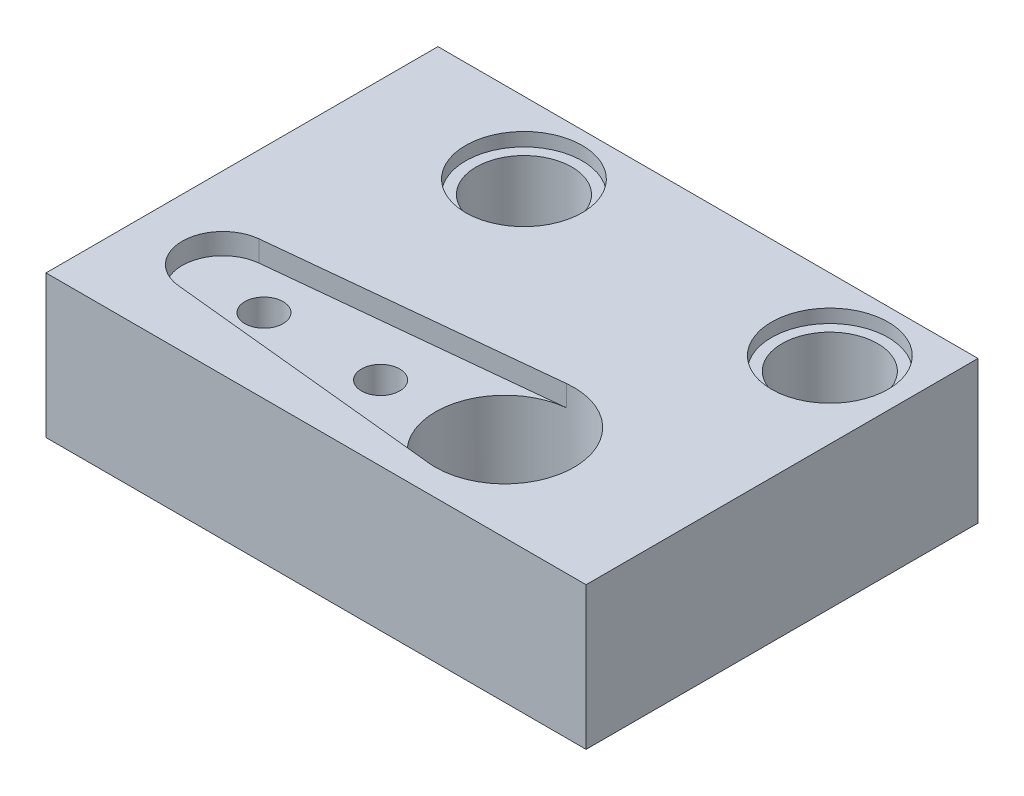
ISO-10303-21;
HEADER;
FILE_DESCRIPTION(('STEP AP214'),'2;1');
FILE_NAME('part.step','',(''),(''),'','','');
FILE_SCHEMA(('AUTOMOTIVE_DESIGN { 1 0 10303 214 1 1 1 1 }'));
ENDSEC;
DATA;
#1=APPLICATION_CONTEXT('core data for automotive mechanical design processes');
#2=APPLICATION_PROTOCOL_DEFINITION('international standard','automotive_design',2000,#1);
#3=PRODUCT_CONTEXT('',#1,'mechanical');
#4=PRODUCT('Part','Part','',(#3));
#5=PRODUCT_RELATED_PRODUCT_CATEGORY('part','',(#4));
#6=PRODUCT_DEFINITION_FORMATION('','',#4);
#7=PRODUCT_DEFINITION_CONTEXT('part definition',#1,'design');
#8=PRODUCT_DEFINITION('design','',#6,#7);
#9=PRODUCT_DEFINITION_SHAPE('','',#8);
#10=(LENGTH_UNIT() NAMED_UNIT(*) SI_UNIT(.MILLI.,.METRE.));
#11=(NAMED_UNIT(*) PLANE_ANGLE_UNIT() SI_UNIT($,.RADIAN.));
#12=(NAMED_UNIT(*) SI_UNIT($,.STERADIAN.) SOLID_ANGLE_UNIT());
#13=UNCERTAINTY_MEASURE_WITH_UNIT(LENGTH_MEASURE(1.E-05),#10,'distance_accuracy_value','');
#14=(GEOMETRIC_REPRESENTATION_CONTEXT(3) GLOBAL_UNCERTAINTY_ASSIGNED_CONTEXT((#13)) GLOBAL_UNIT_ASSIGNED_CONTEXT((#10,
#11,#12)) REPRESENTATION_CONTEXT('',''));
#15=CARTESIAN_POINT('',(0.,0.,0.));
#16=DIRECTION('',(0.,0.,1.));
#17=DIRECTION('',(1.,0.,0.));
#18=AXIS2_PLACEMENT_3D('',#15,#16,#17);
#19=CARTESIAN_POINT('',(-10.75,7.46,-11.75));
#20=DIRECTION('',(0.,-1.,0.));
#21=DIRECTION('',(0.,0.,-1.));
#22=AXIS2_PLACEMENT_3D('',#19,#20,#21);
#23=CYLINDRICAL_SURFACE('',#22,2.5);
#24=CARTESIAN_POINT('',(-10.75,6.76,-11.75));
#25=DIRECTION('',(0.,1.,0.));
#26=DIRECTION('',(0.,0.,1.));
#27=AXIS2_PLACEMENT_3D('',#24,#25,#26);
#28=CIRCLE('',#27,2.5);
#29=CARTESIAN_POINT('',(-10.75,6.76,-14.25));
#30=VERTEX_POINT('',#29);
#31=EDGE_CURVE('E121',#30,#30,#28,.T.);
#32=CARTESIAN_POINT('',(-10.75,0.7,-11.75));
#33=DIRECTION('',(0.,-1.,0.));
#34=DIRECTION('',(0.,0.,-1.));
#35=AXIS2_PLACEMENT_3D('',#32,#33,#34);
#36=CIRCLE('',#35,2.5);
#37=CARTESIAN_POINT('',(-10.75,0.7,-14.25));
#38=VERTEX_POINT('',#37);
#39=EDGE_CURVE('E37',#38,#38,#36,.T.);
#40=CARTESIAN_POINT('',(-10.75,6.76,-14.25));
#41=CARTESIAN_POINT('',(-10.75,6.696875,-14.25));
#42=CARTESIAN_POINT('',(-10.75,6.63375,-14.25));
#43=CARTESIAN_POINT('',(-10.75,6.5075,-14.25));
#44=CARTESIAN_POINT('',(-10.75,6.444375,-14.25));
#45=CARTESIAN_POINT('',(-10.75,6.318125,-14.25));
#46=CARTESIAN_POINT('',(-10.75,6.255,-14.25));
#47=CARTESIAN_POINT('',(-10.75,6.12875,-14.25));
#48=CARTESIAN_POINT('',(-10.75,6.065625,-14.25));
#49=CARTESIAN_POINT('',(-10.75,5.939375,-14.25));
#50=CARTESIAN_POINT('',(-10.75,5.87625,-14.25));
#51=CARTESIAN_POINT('',(-10.75,5.75,-14.25));
#52=CARTESIAN_POINT('',(-10.75,5.686875,-14.25));
#53=CARTESIAN_POINT('',(-10.75,5.560625,-14.25));
#54=CARTESIAN_POINT('',(-10.75,5.4975,-14.25));
#55=CARTESIAN_POINT('',(-10.75,5.37125,-14.25));
#56=CARTESIAN_POINT('',(-10.75,5.308125,-14.25));
#57=CARTESIAN_POINT('',(-10.75,5.181875,-14.25));
#58=CARTESIAN_POINT('',(-10.75,5.11875,-14.25));
#59=CARTESIAN_POINT('',(-10.75,4.9925,-14.25));
#60=CARTESIAN_POINT('',(-10.75,4.929375,-14.25));
#61=CARTESIAN_POINT('',(-10.75,4.803125,-14.25));
#62=CARTESIAN_POINT('',(-10.75,4.74,-14.25));
#63=CARTESIAN_POINT('',(-10.75,4.61375,-14.25));
#64=CARTESIAN_POINT('',(-10.75,4.550625,-14.25));
#65=CARTESIAN_POINT('',(-10.75,4.424375,-14.25));
#66=CARTESIAN_POINT('',(-10.75,4.36125,-14.25));
#67=CARTESIAN_POINT('',(-10.75,4.235,-14.25));
#68=CARTESIAN_POINT('',(-10.75,4.171875,-14.25));
#69=CARTESIAN_POINT('',(-10.75,4.045625,-14.25));
#70=CARTESIAN_POINT('',(-10.75,3.9825,-14.25));
#71=CARTESIAN_POINT('',(-10.75,3.85625,-14.25));
#72=CARTESIAN_POINT('',(-10.75,3.793125,-14.25));
#73=CARTESIAN_POINT('',(-10.75,3.666875,-14.25));
#74=CARTESIAN_POINT('',(-10.75,3.60375,-14.25));
#75=CARTESIAN_POINT('',(-10.75,3.4775,-14.25));
#76=CARTESIAN_POINT('',(-10.75,3.414375,-14.25));
#77=CARTESIAN_POINT('',(-10.75,3.288125,-14.25));
#78=CARTESIAN_POINT('',(-10.75,3.225,-14.25));
#79=CARTESIAN_POINT('',(-10.75,3.09875,-14.25));
#80=CARTESIAN_POINT('',(-10.75,3.035625,-14.25));
#81=CARTESIAN_POINT('',(-10.75,2.909375,-14.25));
#82=CARTESIAN_POINT('',(-10.75,2.84625,-14.25));
#83=CARTESIAN_POINT('',(-10.75,2.72,-14.25));
#84=CARTESIAN_POINT('',(-10.75,2.656875,-14.25));
#85=CARTESIAN_POINT('',(-10.75,2.530625,-14.25));
#86=CARTESIAN_POINT('',(-10.75,2.4675,-14.25));
#87=CARTESIAN_POINT('',(-10.75,2.34125,-14.25));
#88=CARTESIAN_POINT('',(-10.75,2.278125,-14.25));
#89=CARTESIAN_POINT('',(-10.75,2.151875,-14.25));
#90=CARTESIAN_POINT('',(-10.75,2.08875,-14.25));
#91=CARTESIAN_POINT('',(-10.75,1.9625,-14.25));
#92=CARTESIAN_POINT('',(-10.75,1.899375,-14.25));
#93=CARTESIAN_POINT('',(-10.75,1.773125,-14.25));
#94=CARTESIAN_POINT('',(-10.75,1.71,-14.25));
#95=CARTESIAN_POINT('',(-10.75,1.58375,-14.25));
#96=CARTESIAN_POINT('',(-10.75,1.520625,-14.25));
#97=CARTESIAN_POINT('',(-10.75,1.394375,-14.25));
#98=CARTESIAN_POINT('',(-10.75,1.33125,-14.25));
#99=CARTESIAN_POINT('',(-10.75,1.205,-14.25));
#100=CARTESIAN_POINT('',(-10.75,1.141875,-14.25));
#101=CARTESIAN_POINT('',(-10.75,1.015625,-14.25));
#102=CARTESIAN_POINT('',(-10.75,0.952500000000001,-14.25));
#103=CARTESIAN_POINT('',(-10.75,0.82625,-14.25));
#104=CARTESIAN_POINT('',(-10.75,0.763125,-14.25));
#105=CARTESIAN_POINT('',(-10.75,0.7,-14.25));
#106=B_SPLINE_CURVE_WITH_KNOTS('',3,(#40,#41,#42,#43,#44,#45,#46,#47,#48,#49,#50,#51,#52,#53,
#54,#55,#56,#57,#58,#59,#60,#61,#62,#63,#64,#65,#66,#67,#68,#69,#70,#71,#72,#73,#74,#75,#76,#77,
#78,#79,#80,#81,#82,#83,#84,#85,#86,#87,#88,#89,#90,#91,#92,#93,#94,#95,#96,#97,#98,#99,#100,
#101,#102,#103,#104,#105),.UNSPECIFIED.,.F.,.F.,(4,2,2,2,2,2,2,2,2,2,2,2,2,2,2,2,2,2,2,2,2,2,2,
2,2,2,2,2,2,2,2,2,4),(0.,0.189375,0.37875,0.568125,0.7575,0.946875,1.13625,1.325625,1.515,
1.704375,1.89375,2.083125,2.2725,2.461875,2.65125,2.840625,3.03,3.219375,3.40875,3.598125,
3.7875,3.976875,4.16625,4.355625,4.545,4.734375,4.92375,5.113125,5.3025,5.491875,5.68125,
5.870625,6.06),.UNSPECIFIED.);
#107=EDGE_CURVE('BSEAM33',#30,#38,#106,.T.);
#108=ORIENTED_EDGE('',*,*,#31,.T.);
#109=ORIENTED_EDGE('',*,*,#39,.T.);
#110=ORIENTED_EDGE('',*,*,#107,.T.);
#111=ORIENTED_EDGE('',*,*,#107,.F.);
#112=EDGE_LOOP('',(#108,#110,#109,#111));
#113=FACE_BOUND('',#112,.T.);
#114=ADVANCED_FACE('F33',(#113),#23,.F.);
#115=CARTESIAN_POINT('',(5.25,7.46,-11.75));
#116=DIRECTION('',(0.,-1.,0.));
#117=DIRECTION('',(0.,0.,-1.));
#118=AXIS2_PLACEMENT_3D('',#115,#116,#117);
#119=CYLINDRICAL_SURFACE('',#118,2.5);
#120=CARTESIAN_POINT('',(5.25,6.76,-11.75));
#121=DIRECTION('',(0.,1.,0.));
#122=DIRECTION('',(0.,0.,1.));
#123=AXIS2_PLACEMENT_3D('',#120,#121,#122);
#124=CIRCLE('',#123,2.5);
#125=CARTESIAN_POINT('',(5.25,6.76,-14.25));
#126=VERTEX_POINT('',#125);
#127=EDGE_CURVE('E177',#126,#126,#124,.T.);
#128=CARTESIAN_POINT('',(5.25,0.7,-11.75));
#129=DIRECTION('',(0.,-1.,0.));
#130=DIRECTION('',(0.,0.,-1.));
#131=AXIS2_PLACEMENT_3D('',#128,#129,#130);
#132=CIRCLE('',#131,2.5);
#133=CARTESIAN_POINT('',(5.25,0.7,-14.25));
#134=VERTEX_POINT('',#133);
#135=EDGE_CURVE('E181',#134,#134,#132,.T.);
#136=CARTESIAN_POINT('',(5.25,6.76,-14.25));
#137=CARTESIAN_POINT('',(5.25,6.696875,-14.25));
#138=CARTESIAN_POINT('',(5.25,6.63375,-14.25));
#139=CARTESIAN_POINT('',(5.25,6.5075,-14.25));
#140=CARTESIAN_POINT('',(5.25,6.444375,-14.25));
#141=CARTESIAN_POINT('',(5.25,6.318125,-14.25));
#142=CARTESIAN_POINT('',(5.25,6.255,-14.25));
#143=CARTESIAN_POINT('',(5.25,6.12875,-14.25));
#144=CARTESIAN_POINT('',(5.25,6.065625,-14.25));
#145=CARTESIAN_POINT('',(5.25,5.939375,-14.25));
#146=CARTESIAN_POINT('',(5.25,5.87625,-14.25));
#147=CARTESIAN_POINT('',(5.25,5.75,-14.25));
#148=CARTESIAN_POINT('',(5.25,5.686875,-14.25));
#149=CARTESIAN_POINT('',(5.25,5.560625,-14.25));
#150=CARTESIAN_POINT('',(5.25,5.4975,-14.25));
#151=CARTESIAN_POINT('',(5.25,5.37125,-14.25));
#152=CARTESIAN_POINT('',(5.25,5.308125,-14.25));
#153=CARTESIAN_POINT('',(5.25,5.181875,-14.25));
#154=CARTESIAN_POINT('',(5.25,5.11875,-14.25));
#155=CARTESIAN_POINT('',(5.25,4.9925,-14.25));
#156=CARTESIAN_POINT('',(5.25,4.929375,-14.25));
#157=CARTESIAN_POINT('',(5.25,4.803125,-14.25));
#158=CARTESIAN_POINT('',(5.25,4.74,-14.25));
#159=CARTESIAN_POINT('',(5.25,4.61375,-14.25));
#160=CARTESIAN_POINT('',(5.25,4.550625,-14.25));
#161=CARTESIAN_POINT('',(5.25,4.424375,-14.25));
#162=CARTESIAN_POINT('',(5.25,4.36125,-14.25));
#163=CARTESIAN_POINT('',(5.25,4.235,-14.25));
#164=CARTESIAN_POINT('',(5.25,4.171875,-14.25));
#165=CARTESIAN_POINT('',(5.25,4.045625,-14.25));
#166=CARTESIAN_POINT('',(5.25,3.9825,-14.25));
#167=CARTESIAN_POINT('',(5.25,3.85625,-14.25));
#168=CARTESIAN_POINT('',(5.25,3.793125,-14.25));
#169=CARTESIAN_POINT('',(5.25,3.666875,-14.25));
#170=CARTESIAN_POINT('',(5.25,3.60375,-14.25));
#171=CARTESIAN_POINT('',(5.25,3.4775,-14.25));
#172=CARTESIAN_POINT('',(5.25,3.414375,-14.25));
#173=CARTESIAN_POINT('',(5.25,3.288125,-14.25));
#174=CARTESIAN_POINT('',(5.25,3.225,-14.25));
#175=CARTESIAN_POINT('',(5.25,3.09875,-14.25));
#176=CARTESIAN_POINT('',(5.25,3.035625,-14.25));
#177=CARTESIAN_POINT('',(5.25,2.909375,-14.25));
#178=CARTESIAN_POINT('',(5.25,2.84625,-14.25));
#179=CARTESIAN_POINT('',(5.25,2.72,-14.25));
#180=CARTESIAN_POINT('',(5.25,2.656875,-14.25));
#181=CARTESIAN_POINT('',(5.25,2.530625,-14.25));
#182=CARTESIAN_POINT('',(5.25,2.4675,-14.25));
#183=CARTESIAN_POINT('',(5.25,2.34125,-14.25));
#184=CARTESIAN_POINT('',(5.25,2.278125,-14.25));
#185=CARTESIAN_POINT('',(5.25,2.151875,-14.25));
#186=CARTESIAN_POINT('',(5.25,2.08875,-14.25));
#187=CARTESIAN_POINT('',(5.25,1.9625,-14.25));
#188=CARTESIAN_POINT('',(5.25,1.899375,-14.25));
#189=CARTESIAN_POINT('',(5.25,1.773125,-14.25));
#190=CARTESIAN_POINT('',(5.25,1.71,-14.25));
#191=CARTESIAN_POINT('',(5.25,1.58375,-14.25));
#192=CARTESIAN_POINT('',(5.25,1.520625,-14.25));
#193=CARTESIAN_POINT('',(5.25,1.394375,-14.25));
#194=CARTESIAN_POINT('',(5.25,1.33125,-14.25));
#195=CARTESIAN_POINT('',(5.25,1.205,-14.25));
#196=CARTESIAN_POINT('',(5.25,1.141875,-14.25));
#197=CARTESIAN_POINT('',(5.25,1.015625,-14.25));
#198=CARTESIAN_POINT('',(5.25,0.952500000000001,-14.25));
#199=CARTESIAN_POINT('',(5.25,0.82625,-14.25));
#200=CARTESIAN_POINT('',(5.25,0.763125,-14.25));
#201=CARTESIAN_POINT('',(5.25,0.7,-14.25));
#202=B_SPLINE_CURVE_WITH_KNOTS('',3,(#136,#137,#138,#139,#140,#141,#142,#143,#144,#145,#146,
#147,#148,#149,#150,#151,#152,#153,#154,#155,#156,#157,#158,#159,#160,#161,#162,#163,#164,#165,
#166,#167,#168,#169,#170,#171,#172,#173,#174,#175,#176,#177,#178,#179,#180,#181,#182,#183,#184,
#185,#186,#187,#188,#189,#190,#191,#192,#193,#194,#195,#196,#197,#198,#199,#200,#201),
.UNSPECIFIED.,.F.,.F.,(4,2,2,2,2,2,2,2,2,2,2,2,2,2,2,2,2,2,2,2,2,2,2,2,2,2,2,2,2,2,2,2,4),(0.,
0.189375,0.37875,0.568125,0.7575,0.946875,1.13625,1.325625,1.515,1.704375,1.89375,2.083125,
2.2725,2.461875,2.65125,2.840625,3.03,3.219375,3.40875,3.598125,3.7875,3.976875,4.16625,
4.355625,4.545,4.734375,4.92375,5.113125,5.3025,5.491875,5.68125,5.870625,6.06),.UNSPECIFIED.);
#203=EDGE_CURVE('BSEAM226',#126,#134,#202,.T.);
#204=ORIENTED_EDGE('',*,*,#127,.T.);
#205=ORIENTED_EDGE('',*,*,#135,.T.);
#206=ORIENTED_EDGE('',*,*,#203,.T.);
#207=ORIENTED_EDGE('',*,*,#203,.F.);
#208=EDGE_LOOP('',(#204,#206,#205,#207));
#209=FACE_BOUND('',#208,.T.);
#210=ADVANCED_FACE('F226',(#209),#119,.F.);
#211=CARTESIAN_POINT('',(0.,7.46,0.));
#212=DIRECTION('',(0.,1.,0.));
#213=DIRECTION('',(0.,0.,1.));
#214=AXIS2_PLACEMENT_3D('',#211,#212,#213);
#215=PLANE('',#214);
#216=CARTESIAN_POINT('',(5.25,7.46,-11.75));
#217=DIRECTION('',(0.,1.,0.));
#218=DIRECTION('',(0.,0.,1.));
#219=AXIS2_PLACEMENT_3D('',#216,#217,#218);
#220=CIRCLE('',#219,3.05);
#221=CARTESIAN_POINT('',(5.25,7.46,-8.69999999999999));
#222=VERTEX_POINT('',#221);
#223=EDGE_CURVE('E183',#222,#222,#220,.T.);
#224=ORIENTED_EDGE('',*,*,#223,.F.);
#225=EDGE_LOOP('',(#224));
#226=FACE_BOUND('',#225,.T.);
#227=CARTESIAN_POINT('',(-10.75,7.46,-11.75));
#228=DIRECTION('',(0.,1.,0.));
#229=DIRECTION('',(0.,0.,1.));
#230=AXIS2_PLACEMENT_3D('',#227,#228,#229);
#231=CIRCLE('',#230,3.05);
#232=CARTESIAN_POINT('',(-10.75,7.46,-8.7));
#233=VERTEX_POINT('',#232);
#234=EDGE_CURVE('E179',#233,#233,#231,.T.);
#235=ORIENTED_EDGE('',*,*,#234,.F.);
#236=EDGE_LOOP('',(#235));
#237=FACE_BOUND('',#236,.T.);
#238=CARTESIAN_POINT('',(-14.75,7.46,0.));
#239=DIRECTION('',(0.,1.,0.));
#240=DIRECTION('',(0.,0.,1.));
#241=AXIS2_PLACEMENT_3D('',#238,#239,#240);
#242=CIRCLE('',#241,2.125);
#243=CARTESIAN_POINT('',(-14.9654595343537,7.46,-2.11404876695314));
#244=VERTEX_POINT('',#243);
#245=CARTESIAN_POINT('',(-14.9654595343537,7.46,2.11404876695314));
#246=VERTEX_POINT('',#245);
#247=EDGE_CURVE('E50',#244,#246,#242,.T.);
#248=ORIENTED_EDGE('',*,*,#247,.F.);
#249=DIRECTION('',(-0.994846478566184,0.,0.101392722048793));
#250=VECTOR('',#249,1.);
#251=CARTESIAN_POINT('',(-14.9654595343537,7.46,-2.11404876695314));
#252=LINE('',#251,#250);
#253=CARTESIAN_POINT('',(-0.367096674599524,7.46,-3.60188410606974));
#254=VERTEX_POINT('',#253);
#255=EDGE_CURVE('E150',#254,#244,#252,.T.);
#256=ORIENTED_EDGE('',*,*,#255,.F.);
#257=CARTESIAN_POINT('',(0.,7.46,0.));
#258=DIRECTION('',(0.,1.,0.));
#259=DIRECTION('',(0.,0.,1.));
#260=AXIS2_PLACEMENT_3D('',#257,#258,#259);
#261=CIRCLE('',#260,3.62054265021969);
#262=CARTESIAN_POINT('',(-0.367096674599523,7.46,3.60188410606974));
#263=VERTEX_POINT('',#262);
#264=EDGE_CURVE('E128',#263,#254,#261,.T.);
#265=ORIENTED_EDGE('',*,*,#264,.F.);
#266=DIRECTION('',(0.994846478566184,0.,0.101392722048792));
#267=VECTOR('',#266,1.);
#268=CARTESIAN_POINT('',(-14.9654595343537,7.46,2.11404876695314));
#269=LINE('',#268,#267);
#270=EDGE_CURVE('E145',#246,#263,#269,.T.);
#271=ORIENTED_EDGE('',*,*,#270,.F.);
#272=EDGE_LOOP('',(#248,#256,#265,#271));
#273=FACE_BOUND('',#272,.T.);
#274=DIRECTION('',(0.,0.,-1.));
#275=VECTOR('',#274,1.);
#276=CARTESIAN_POINT('',(9.25,7.46,-15.5));
#277=LINE('',#276,#275);
#278=CARTESIAN_POINT('',(9.25000000000001,7.46,5.));
#279=VERTEX_POINT('',#278);
#280=CARTESIAN_POINT('',(9.25,7.46,-15.5));
#281=VERTEX_POINT('',#280);
#282=EDGE_CURVE('E155',#279,#281,#277,.T.);
#283=ORIENTED_EDGE('',*,*,#282,.T.);
#284=DIRECTION('',(-1.,0.,0.));
#285=VECTOR('',#284,1.);
#286=CARTESIAN_POINT('',(9.25,7.46,-15.5));
#287=LINE('',#286,#285);
#288=CARTESIAN_POINT('',(-19.,7.46,-15.5));
#289=VERTEX_POINT('',#288);
#290=EDGE_CURVE('E87',#281,#289,#287,.T.);
#291=ORIENTED_EDGE('',*,*,#290,.T.);
#292=DIRECTION('',(0.,0.,1.));
#293=VECTOR('',#292,1.);
#294=CARTESIAN_POINT('',(-19.,7.46,-15.5));
#295=LINE('',#294,#293);
#296=CARTESIAN_POINT('',(-19.,7.46,5.));
#297=VERTEX_POINT('',#296);
#298=EDGE_CURVE('E158',#289,#297,#295,.T.);
#299=ORIENTED_EDGE('',*,*,#298,.T.);
#300=DIRECTION('',(1.,0.,0.));
#301=VECTOR('',#300,1.);
#302=CARTESIAN_POINT('',(-19.,7.46,5.));
#303=LINE('',#302,#301);
#304=EDGE_CURVE('E59',#297,#279,#303,.T.);
#305=ORIENTED_EDGE('',*,*,#304,.T.);
#306=EDGE_LOOP('',(#283,#291,#299,#305));
#307=FACE_BOUND('',#306,.T.);
#308=ADVANCED_FACE('F223',(#226,#237,#273,#307),#215,.T.);
#309=CARTESIAN_POINT('',(0.,0.,0.));
#310=DIRECTION('',(0.,1.,0.));
#311=DIRECTION('',(0.,0.,1.));
#312=AXIS2_PLACEMENT_3D('',#309,#310,#311);
#313=PLANE('',#312);
#314=CARTESIAN_POINT('',(-10.75,0.,-11.75));
#315=DIRECTION('',(0.,-1.,0.));
#316=DIRECTION('',(0.,0.,-1.));
#317=AXIS2_PLACEMENT_3D('',#314,#315,#316);
#318=CIRCLE('',#317,3.05);
#319=CARTESIAN_POINT('',(-10.75,0.,-14.8));
#320=VERTEX_POINT('',#319);
#321=EDGE_CURVE('E197',#320,#320,#318,.T.);
#322=ORIENTED_EDGE('',*,*,#321,.F.);
#323=EDGE_LOOP('',(#322));
#324=FACE_BOUND('',#323,.T.);
#325=CARTESIAN_POINT('',(5.25,0.,-11.75));
#326=DIRECTION('',(0.,-1.,0.));
#327=DIRECTION('',(0.,0.,-1.));
#328=AXIS2_PLACEMENT_3D('',#325,#326,#327);
#329=CIRCLE('',#328,3.05);
#330=CARTESIAN_POINT('',(5.25,0.,-14.8));
#331=VERTEX_POINT('',#330);
#332=EDGE_CURVE('E190',#331,#331,#329,.T.);
#333=ORIENTED_EDGE('',*,*,#332,.F.);
#334=EDGE_LOOP('',(#333));
#335=FACE_BOUND('',#334,.T.);
#336=CARTESIAN_POINT('',(-6.5,0.,0.));
#337=DIRECTION('',(0.,1.,0.));
#338=DIRECTION('',(0.,0.,1.));
#339=AXIS2_PLACEMENT_3D('',#336,#337,#338);
#340=CIRCLE('',#339,1.);
#341=CARTESIAN_POINT('',(-6.5,0.,1.));
#342=VERTEX_POINT('',#341);
#343=EDGE_CURVE('E206',#342,#342,#340,.T.);
#344=ORIENTED_EDGE('',*,*,#343,.T.);
#345=EDGE_LOOP('',(#344));
#346=FACE_BOUND('',#345,.T.);
#347=CARTESIAN_POINT('',(0.,0.,0.));
#348=DIRECTION('',(0.,1.,0.));
#349=DIRECTION('',(0.,0.,1.));
#350=AXIS2_PLACEMENT_3D('',#347,#348,#349);
#351=CIRCLE('',#350,3.62054265021969);
#352=CARTESIAN_POINT('',(0.,0.,3.62054265021969));
#353=VERTEX_POINT('',#352);
#354=EDGE_CURVE('E120',#353,#353,#351,.T.);
#355=ORIENTED_EDGE('',*,*,#354,.T.);
#356=EDGE_LOOP('',(#355));
#357=FACE_BOUND('',#356,.T.);
#358=CARTESIAN_POINT('',(-12.6,0.,0.));
#359=DIRECTION('',(0.,1.,0.));
#360=DIRECTION('',(0.,0.,1.));
#361=AXIS2_PLACEMENT_3D('',#358,#359,#360);
#362=CIRCLE('',#361,1.);
#363=CARTESIAN_POINT('',(-12.6,0.,1.));
#364=VERTEX_POINT('',#363);
#365=EDGE_CURVE('E146',#364,#364,#362,.T.);
#366=ORIENTED_EDGE('',*,*,#365,.T.);
#367=EDGE_LOOP('',(#366));
#368=FACE_BOUND('',#367,.T.);
#369=DIRECTION('',(0.,0.,-1.));
#370=VECTOR('',#369,1.);
#371=CARTESIAN_POINT('',(9.25,0.,-15.5));
#372=LINE('',#371,#370);
#373=CARTESIAN_POINT('',(9.25000000000001,0.,5.));
#374=VERTEX_POINT('',#373);
#375=CARTESIAN_POINT('',(9.25,0.,-15.5));
#376=VERTEX_POINT('',#375);
#377=EDGE_CURVE('E152',#374,#376,#372,.T.);
#378=ORIENTED_EDGE('',*,*,#377,.F.);
#379=DIRECTION('',(1.,0.,0.));
#380=VECTOR('',#379,1.);
#381=CARTESIAN_POINT('',(-19.,0.,5.));
#382=LINE('',#381,#380);
#383=CARTESIAN_POINT('',(-19.,0.,5.));
#384=VERTEX_POINT('',#383);
#385=EDGE_CURVE('E80',#384,#374,#382,.T.);
#386=ORIENTED_EDGE('',*,*,#385,.F.);
#387=DIRECTION('',(0.,0.,1.));
#388=VECTOR('',#387,1.);
#389=CARTESIAN_POINT('',(-19.,0.,-15.5));
#390=LINE('',#389,#388);
#391=CARTESIAN_POINT('',(-19.,0.,-15.5));
#392=VERTEX_POINT('',#391);
#393=EDGE_CURVE('E166',#392,#384,#390,.T.);
#394=ORIENTED_EDGE('',*,*,#393,.F.);
#395=DIRECTION('',(-1.,0.,0.));
#396=VECTOR('',#395,1.);
#397=CARTESIAN_POINT('',(9.25,0.,-15.5));
#398=LINE('',#397,#396);
#399=EDGE_CURVE('E164',#376,#392,#398,.T.);
#400=ORIENTED_EDGE('',*,*,#399,.F.);
#401=EDGE_LOOP('',(#378,#386,#394,#400));
#402=FACE_BOUND('',#401,.T.);
#403=ADVANCED_FACE('F225',(#324,#335,#346,#357,#368,#402),#313,.F.);
#404=CARTESIAN_POINT('',(9.25,7.46,-15.5));
#405=DIRECTION('',(-1.,0.,0.));
#406=DIRECTION('',(0.,0.,1.));
#407=AXIS2_PLACEMENT_3D('',#404,#405,#406);
#408=PLANE('',#407);
#409=ORIENTED_EDGE('',*,*,#377,.T.);
#410=DIRECTION('',(0.,-1.,0.));
#411=VECTOR('',#410,1.);
#412=CARTESIAN_POINT('',(9.25,7.46,-15.5));
#413=LINE('',#412,#411);
#414=EDGE_CURVE('E11',#281,#376,#413,.T.);
#415=ORIENTED_EDGE('',*,*,#414,.F.);
#416=ORIENTED_EDGE('',*,*,#282,.F.);
#417=DIRECTION('',(0.,-1.,0.));
#418=VECTOR('',#417,1.);
#419=CARTESIAN_POINT('',(9.25000000000001,7.46,5.));
#420=LINE('',#419,#418);
#421=EDGE_CURVE('E161',#279,#374,#420,.T.);
#422=ORIENTED_EDGE('',*,*,#421,.T.);
#423=EDGE_LOOP('',(#409,#415,#416,#422));
#424=FACE_BOUND('',#423,.T.);
#425=ADVANCED_FACE('F35',(#424),#408,.F.);
#426=CARTESIAN_POINT('',(9.25,7.46,-15.5));
#427=DIRECTION('',(0.,0.,1.));
#428=DIRECTION('',(1.,0.,0.));
#429=AXIS2_PLACEMENT_3D('',#426,#427,#428);
#430=PLANE('',#429);
#431=ORIENTED_EDGE('',*,*,#399,.T.);
#432=DIRECTION('',(0.,-1.,0.));
#433=VECTOR('',#432,1.);
#434=CARTESIAN_POINT('',(-19.,7.46,-15.5));
#435=LINE('',#434,#433);
#436=EDGE_CURVE('E42',#289,#392,#435,.T.);
#437=ORIENTED_EDGE('',*,*,#436,.F.);
#438=ORIENTED_EDGE('',*,*,#290,.F.);
#439=ORIENTED_EDGE('',*,*,#414,.T.);
#440=EDGE_LOOP('',(#431,#437,#438,#439));
#441=FACE_BOUND('',#440,.T.);
#442=ADVANCED_FACE('F233',(#441),#430,.F.);
#443=CARTESIAN_POINT('',(-19.,7.46,-15.5));
#444=DIRECTION('',(1.,0.,0.));
#445=DIRECTION('',(0.,0.,-1.));
#446=AXIS2_PLACEMENT_3D('',#443,#444,#445);
#447=PLANE('',#446);
#448=ORIENTED_EDGE('',*,*,#393,.T.);
#449=DIRECTION('',(0.,-1.,0.));
#450=VECTOR('',#449,1.);
#451=CARTESIAN_POINT('',(-19.,7.46,5.));
#452=LINE('',#451,#450);
#453=EDGE_CURVE('E170',#297,#384,#452,.T.);
#454=ORIENTED_EDGE('',*,*,#453,.F.);
#455=ORIENTED_EDGE('',*,*,#298,.F.);
#456=ORIENTED_EDGE('',*,*,#436,.T.);
#457=EDGE_LOOP('',(#448,#454,#455,#456));
#458=FACE_BOUND('',#457,.T.);
#459=ADVANCED_FACE('F238',(#458),#447,.F.);
#460=CARTESIAN_POINT('',(-19.,7.46,5.));
#461=DIRECTION('',(0.,0.,-1.));
#462=DIRECTION('',(-1.,0.,0.));
#463=AXIS2_PLACEMENT_3D('',#460,#461,#462);
#464=PLANE('',#463);
#465=ORIENTED_EDGE('',*,*,#385,.T.);
#466=ORIENTED_EDGE('',*,*,#421,.F.);
#467=ORIENTED_EDGE('',*,*,#304,.F.);
#468=ORIENTED_EDGE('',*,*,#453,.T.);
#469=EDGE_LOOP('',(#465,#466,#467,#468));
#470=FACE_BOUND('',#469,.T.);
#471=ADVANCED_FACE('F261',(#470),#464,.F.);
#472=CARTESIAN_POINT('',(-14.75,6.36,0.));
#473=DIRECTION('',(0.,1.,0.));
#474=DIRECTION('',(0.,0.,1.));
#475=AXIS2_PLACEMENT_3D('',#472,#473,#474);
#476=CYLINDRICAL_SURFACE('',#475,2.125);
#477=ORIENTED_EDGE('',*,*,#247,.T.);
#478=DIRECTION('',(0.,1.,0.));
#479=VECTOR('',#478,1.);
#480=CARTESIAN_POINT('',(-14.9654595343537,6.36,2.11404876695314));
#481=LINE('',#480,#479);
#482=CARTESIAN_POINT('',(-14.9654595343537,6.36,2.11404876695314));
#483=VERTEX_POINT('',#482);
#484=EDGE_CURVE('E137',#483,#246,#481,.T.);
#485=ORIENTED_EDGE('',*,*,#484,.F.);
#486=CARTESIAN_POINT('',(-14.75,6.36,0.));
#487=DIRECTION('',(0.,1.,0.));
#488=DIRECTION('',(0.,0.,1.));
#489=AXIS2_PLACEMENT_3D('',#486,#487,#488);
#490=CIRCLE('',#489,2.125);
#491=CARTESIAN_POINT('',(-14.9654595343537,6.36,-2.11404876695314));
#492=VERTEX_POINT('',#491);
#493=EDGE_CURVE('E140',#492,#483,#490,.T.);
#494=ORIENTED_EDGE('',*,*,#493,.F.);
#495=DIRECTION('',(0.,1.,0.));
#496=VECTOR('',#495,1.);
#497=CARTESIAN_POINT('',(-14.9654595343537,6.36,-2.11404876695314));
#498=LINE('',#497,#496);
#499=EDGE_CURVE('E132',#492,#244,#498,.T.);
#500=ORIENTED_EDGE('',*,*,#499,.T.);
#501=EDGE_LOOP('',(#477,#485,#494,#500));
#502=FACE_BOUND('',#501,.T.);
#503=ADVANCED_FACE('F218',(#502),#476,.F.);
#504=CARTESIAN_POINT('',(-14.9654595343537,6.36,-2.11404876695314));
#505=DIRECTION('',(-0.101392722048793,0.,-0.994846478566184));
#506=DIRECTION('',(-0.994846478566184,0.,0.101392722048793));
#507=AXIS2_PLACEMENT_3D('',#504,#505,#506);
#508=PLANE('',#507);
#509=ORIENTED_EDGE('',*,*,#255,.T.);
#510=ORIENTED_EDGE('',*,*,#499,.F.);
#511=DIRECTION('',(-0.994846478566184,0.,0.101392722048793));
#512=VECTOR('',#511,1.);
#513=CARTESIAN_POINT('',(-14.9654595343537,6.36,-2.11404876695314));
#514=LINE('',#513,#512);
#515=CARTESIAN_POINT('',(-0.367096674599524,6.36,-3.60188410606974));
#516=VERTEX_POINT('',#515);
#517=EDGE_CURVE('E115',#516,#492,#514,.T.);
#518=ORIENTED_EDGE('',*,*,#517,.F.);
#519=DIRECTION('',(0.,1.,0.));
#520=VECTOR('',#519,1.);
#521=CARTESIAN_POINT('',(-0.367096674599524,6.36,-3.60188410606974));
#522=LINE('',#521,#520);
#523=EDGE_CURVE('E124',#516,#254,#522,.T.);
#524=ORIENTED_EDGE('',*,*,#523,.T.);
#525=EDGE_LOOP('',(#509,#510,#518,#524));
#526=FACE_BOUND('',#525,.T.);
#527=ADVANCED_FACE('F135',(#526),#508,.F.);
#528=CARTESIAN_POINT('',(0.,6.36,0.));
#529=DIRECTION('',(0.,1.,0.));
#530=DIRECTION('',(0.,0.,1.));
#531=AXIS2_PLACEMENT_3D('',#528,#529,#530);
#532=CYLINDRICAL_SURFACE('',#531,3.62054265021969);
#533=ORIENTED_EDGE('',*,*,#264,.T.);
#534=ORIENTED_EDGE('',*,*,#523,.F.);
#535=CARTESIAN_POINT('',(0.,6.36,0.));
#536=DIRECTION('',(0.,1.,0.));
#537=DIRECTION('',(0.,0.,1.));
#538=AXIS2_PLACEMENT_3D('',#535,#536,#537);
#539=CIRCLE('',#538,3.62054265021969);
#540=CARTESIAN_POINT('',(-0.367096674599523,6.36,3.60188410606974));
#541=VERTEX_POINT('',#540);
#542=EDGE_CURVE('E109',#516,#541,#539,.T.);
#543=ORIENTED_EDGE('',*,*,#542,.T.);
#544=DIRECTION('',(0.,1.,0.));
#545=VECTOR('',#544,1.);
#546=CARTESIAN_POINT('',(-0.367096674599523,6.36,3.60188410606974));
#547=LINE('',#546,#545);
#548=EDGE_CURVE('E133',#541,#263,#547,.T.);
#549=ORIENTED_EDGE('',*,*,#548,.T.);
#550=EDGE_LOOP('',(#533,#534,#543,#549));
#551=FACE_BOUND('',#550,.T.);
#552=ORIENTED_EDGE('',*,*,#354,.F.);
#553=EDGE_LOOP('',(#552));
#554=FACE_BOUND('',#553,.T.);
#555=ADVANCED_FACE('F125',(#551,#554),#532,.F.);
#556=CARTESIAN_POINT('',(-14.9654595343537,6.36,2.11404876695314));
#557=DIRECTION('',(-0.101392722048792,0.,0.994846478566184));
#558=DIRECTION('',(0.994846478566184,0.,0.101392722048792));
#559=AXIS2_PLACEMENT_3D('',#556,#557,#558);
#560=PLANE('',#559);
#561=ORIENTED_EDGE('',*,*,#270,.T.);
#562=ORIENTED_EDGE('',*,*,#548,.F.);
#563=DIRECTION('',(0.994846478566184,0.,0.101392722048792));
#564=VECTOR('',#563,1.);
#565=CARTESIAN_POINT('',(-14.9654595343537,6.36,2.11404876695314));
#566=LINE('',#565,#564);
#567=EDGE_CURVE('E117',#483,#541,#566,.T.);
#568=ORIENTED_EDGE('',*,*,#567,.F.);
#569=ORIENTED_EDGE('',*,*,#484,.T.);
#570=EDGE_LOOP('',(#561,#562,#568,#569));
#571=FACE_BOUND('',#570,.T.);
#572=ADVANCED_FACE('F221',(#571),#560,.F.);
#573=CARTESIAN_POINT('',(-14.75,6.36,0.));
#574=DIRECTION('',(0.,1.,0.));
#575=DIRECTION('',(0.,0.,1.));
#576=AXIS2_PLACEMENT_3D('',#573,#574,#575);
#577=PLANE('',#576);
#578=CARTESIAN_POINT('',(-6.5,6.36,0.));
#579=DIRECTION('',(0.,1.,0.));
#580=DIRECTION('',(0.,0.,1.));
#581=AXIS2_PLACEMENT_3D('',#578,#579,#580);
#582=CIRCLE('',#581,1.);
#583=CARTESIAN_POINT('',(-6.5,6.36,1.));
#584=VERTEX_POINT('',#583);
#585=EDGE_CURVE('E210',#584,#584,#582,.T.);
#586=ORIENTED_EDGE('',*,*,#585,.F.);
#587=EDGE_LOOP('',(#586));
#588=FACE_BOUND('',#587,.T.);
#589=ORIENTED_EDGE('',*,*,#542,.F.);
#590=ORIENTED_EDGE('',*,*,#517,.T.);
#591=ORIENTED_EDGE('',*,*,#493,.T.);
#592=ORIENTED_EDGE('',*,*,#567,.T.);
#593=EDGE_LOOP('',(#589,#590,#591,#592));
#594=FACE_BOUND('',#593,.T.);
#595=CARTESIAN_POINT('',(-12.6,6.36,0.));
#596=DIRECTION('',(0.,1.,0.));
#597=DIRECTION('',(0.,0.,1.));
#598=AXIS2_PLACEMENT_3D('',#595,#596,#597);
#599=CIRCLE('',#598,1.);
#600=CARTESIAN_POINT('',(-12.6,6.36,1.));
#601=VERTEX_POINT('',#600);
#602=EDGE_CURVE('E209',#601,#601,#599,.T.);
#603=ORIENTED_EDGE('',*,*,#602,.F.);
#604=EDGE_LOOP('',(#603));
#605=FACE_BOUND('',#604,.T.);
#606=ADVANCED_FACE('F111',(#588,#594,#605),#577,.T.);
#607=CARTESIAN_POINT('',(-12.6,0.,0.));
#608=DIRECTION('',(0.,1.,0.));
#609=DIRECTION('',(0.,0.,1.));
#610=AXIS2_PLACEMENT_3D('',#607,#608,#609);
#611=CYLINDRICAL_SURFACE('',#610,1.);
#612=ORIENTED_EDGE('',*,*,#365,.F.);
#613=EDGE_LOOP('',(#612));
#614=FACE_BOUND('',#613,.T.);
#615=ORIENTED_EDGE('',*,*,#602,.T.);
#616=EDGE_LOOP('',(#615));
#617=FACE_BOUND('',#616,.T.);
#618=ADVANCED_FACE('F270',(#614,#617),#611,.F.);
#619=CARTESIAN_POINT('',(-6.5,0.,0.));
#620=DIRECTION('',(0.,1.,0.));
#621=DIRECTION('',(0.,0.,1.));
#622=AXIS2_PLACEMENT_3D('',#619,#620,#621);
#623=CYLINDRICAL_SURFACE('',#622,1.);
#624=ORIENTED_EDGE('',*,*,#343,.F.);
#625=EDGE_LOOP('',(#624));
#626=FACE_BOUND('',#625,.T.);
#627=ORIENTED_EDGE('',*,*,#585,.T.);
#628=EDGE_LOOP('',(#627));
#629=FACE_BOUND('',#628,.T.);
#630=ADVANCED_FACE('F274',(#626,#629),#623,.F.);
#631=CARTESIAN_POINT('',(-10.75,6.76,-11.75));
#632=DIRECTION('',(0.,1.,0.));
#633=DIRECTION('',(0.,0.,1.));
#634=AXIS2_PLACEMENT_3D('',#631,#632,#633);
#635=CYLINDRICAL_SURFACE('',#634,3.05);
#636=CARTESIAN_POINT('',(-10.75,6.76,-11.75));
#637=DIRECTION('',(0.,1.,0.));
#638=DIRECTION('',(0.,0.,1.));
#639=AXIS2_PLACEMENT_3D('',#636,#637,#638);
#640=CIRCLE('',#639,3.05);
#641=CARTESIAN_POINT('',(-10.75,6.76,-8.7));
#642=VERTEX_POINT('',#641);
#643=EDGE_CURVE('E176',#642,#642,#640,.T.);
#644=ORIENTED_EDGE('',*,*,#643,.F.);
#645=EDGE_LOOP('',(#644));
#646=FACE_BOUND('',#645,.T.);
#647=ORIENTED_EDGE('',*,*,#234,.T.);
#648=EDGE_LOOP('',(#647));
#649=FACE_BOUND('',#648,.T.);
#650=ADVANCED_FACE('F278',(#646,#649),#635,.F.);
#651=CARTESIAN_POINT('',(-10.75,6.76,-11.75));
#652=DIRECTION('',(0.,1.,0.));
#653=DIRECTION('',(0.,0.,1.));
#654=AXIS2_PLACEMENT_3D('',#651,#652,#653);
#655=PLANE('',#654);
#656=ORIENTED_EDGE('',*,*,#31,.F.);
#657=EDGE_LOOP('',(#656));
#658=FACE_BOUND('',#657,.T.);
#659=ORIENTED_EDGE('',*,*,#643,.T.);
#660=EDGE_LOOP('',(#659));
#661=FACE_BOUND('',#660,.T.);
#662=ADVANCED_FACE('F282',(#658,#661),#655,.T.);
#663=CARTESIAN_POINT('',(5.25,6.76,-11.75));
#664=DIRECTION('',(0.,1.,0.));
#665=DIRECTION('',(0.,0.,1.));
#666=AXIS2_PLACEMENT_3D('',#663,#664,#665);
#667=CYLINDRICAL_SURFACE('',#666,3.05);
#668=CARTESIAN_POINT('',(5.25,6.76,-11.75));
#669=DIRECTION('',(0.,1.,0.));
#670=DIRECTION('',(0.,0.,1.));
#671=AXIS2_PLACEMENT_3D('',#668,#669,#670);
#672=CIRCLE('',#671,3.05);
#673=CARTESIAN_POINT('',(5.25,6.76,-8.69999999999999));
#674=VERTEX_POINT('',#673);
#675=EDGE_CURVE('E180',#674,#674,#672,.T.);
#676=ORIENTED_EDGE('',*,*,#675,.F.);
#677=EDGE_LOOP('',(#676));
#678=FACE_BOUND('',#677,.T.);
#679=ORIENTED_EDGE('',*,*,#223,.T.);
#680=EDGE_LOOP('',(#679));
#681=FACE_BOUND('',#680,.T.);
#682=ADVANCED_FACE('F286',(#678,#681),#667,.F.);
#683=CARTESIAN_POINT('',(5.25,6.76,-11.75));
#684=DIRECTION('',(0.,1.,0.));
#685=DIRECTION('',(0.,0.,1.));
#686=AXIS2_PLACEMENT_3D('',#683,#684,#685);
#687=PLANE('',#686);
#688=ORIENTED_EDGE('',*,*,#127,.F.);
#689=EDGE_LOOP('',(#688));
#690=FACE_BOUND('',#689,.T.);
#691=ORIENTED_EDGE('',*,*,#675,.T.);
#692=EDGE_LOOP('',(#691));
#693=FACE_BOUND('',#692,.T.);
#694=ADVANCED_FACE('F290',(#690,#693),#687,.T.);
#695=CARTESIAN_POINT('',(5.25,0.7,-11.75));
#696=DIRECTION('',(0.,-1.,0.));
#697=DIRECTION('',(0.,0.,-1.));
#698=AXIS2_PLACEMENT_3D('',#695,#696,#697);
#699=CYLINDRICAL_SURFACE('',#698,3.05);
#700=CARTESIAN_POINT('',(5.25,0.7,-11.75));
#701=DIRECTION('',(0.,-1.,0.));
#702=DIRECTION('',(0.,0.,-1.));
#703=AXIS2_PLACEMENT_3D('',#700,#701,#702);
#704=CIRCLE('',#703,3.05);
#705=CARTESIAN_POINT('',(5.25,0.7,-14.8));
#706=VERTEX_POINT('',#705);
#707=EDGE_CURVE('E184',#706,#706,#704,.T.);
#708=ORIENTED_EDGE('',*,*,#707,.F.);
#709=EDGE_LOOP('',(#708));
#710=FACE_BOUND('',#709,.T.);
#711=ORIENTED_EDGE('',*,*,#332,.T.);
#712=EDGE_LOOP('',(#711));
#713=FACE_BOUND('',#712,.T.);
#714=ADVANCED_FACE('F294',(#710,#713),#699,.F.);
#715=CARTESIAN_POINT('',(5.25,0.7,-11.75));
#716=DIRECTION('',(0.,-1.,0.));
#717=DIRECTION('',(0.,0.,-1.));
#718=AXIS2_PLACEMENT_3D('',#715,#716,#717);
#719=PLANE('',#718);
#720=ORIENTED_EDGE('',*,*,#135,.F.);
#721=EDGE_LOOP('',(#720));
#722=FACE_BOUND('',#721,.T.);
#723=ORIENTED_EDGE('',*,*,#707,.T.);
#724=EDGE_LOOP('',(#723));
#725=FACE_BOUND('',#724,.T.);
#726=ADVANCED_FACE('F298',(#722,#725),#719,.T.);
#727=CARTESIAN_POINT('',(-10.75,0.7,-11.75));
#728=DIRECTION('',(0.,-1.,0.));
#729=DIRECTION('',(0.,0.,-1.));
#730=AXIS2_PLACEMENT_3D('',#727,#728,#729);
#731=CYLINDRICAL_SURFACE('',#730,3.05);
#732=CARTESIAN_POINT('',(-10.75,0.7,-11.75));
#733=DIRECTION('',(0.,-1.,0.));
#734=DIRECTION('',(0.,0.,-1.));
#735=AXIS2_PLACEMENT_3D('',#732,#733,#734);
#736=CIRCLE('',#735,3.05);
#737=CARTESIAN_POINT('',(-10.75,0.7,-14.8));
#738=VERTEX_POINT('',#737);
#739=EDGE_CURVE('E317',#738,#738,#736,.T.);
#740=ORIENTED_EDGE('',*,*,#739,.F.);
#741=EDGE_LOOP('',(#740));
#742=FACE_BOUND('',#741,.T.);
#743=ORIENTED_EDGE('',*,*,#321,.T.);
#744=EDGE_LOOP('',(#743));
#745=FACE_BOUND('',#744,.T.);
#746=ADVANCED_FACE('F302',(#742,#745),#731,.F.);
#747=CARTESIAN_POINT('',(-10.75,0.7,-11.75));
#748=DIRECTION('',(0.,-1.,0.));
#749=DIRECTION('',(0.,0.,-1.));
#750=AXIS2_PLACEMENT_3D('',#747,#748,#749);
#751=PLANE('',#750);
#752=ORIENTED_EDGE('',*,*,#39,.F.);
#753=EDGE_LOOP('',(#752));
#754=FACE_BOUND('',#753,.T.);
#755=ORIENTED_EDGE('',*,*,#739,.T.);
#756=EDGE_LOOP('',(#755));
#757=FACE_BOUND('',#756,.T.);
#758=ADVANCED_FACE('F306',(#754,#757),#751,.T.);
#759=CLOSED_SHELL('',(#114,#210,#308,#403,#425,#442,#459,#471,#503,#527,#555,#572,#606,#618,
#630,#650,#662,#682,#694,#714,#726,#746,#758));
#760=MANIFOLD_SOLID_BREP('B2',#759);
#761=ADVANCED_BREP_SHAPE_REPRESENTATION('',(#18,#760),#14);
#762=SHAPE_DEFINITION_REPRESENTATION(#9,#761);
ENDSEC;
END-ISO-10303-21;
